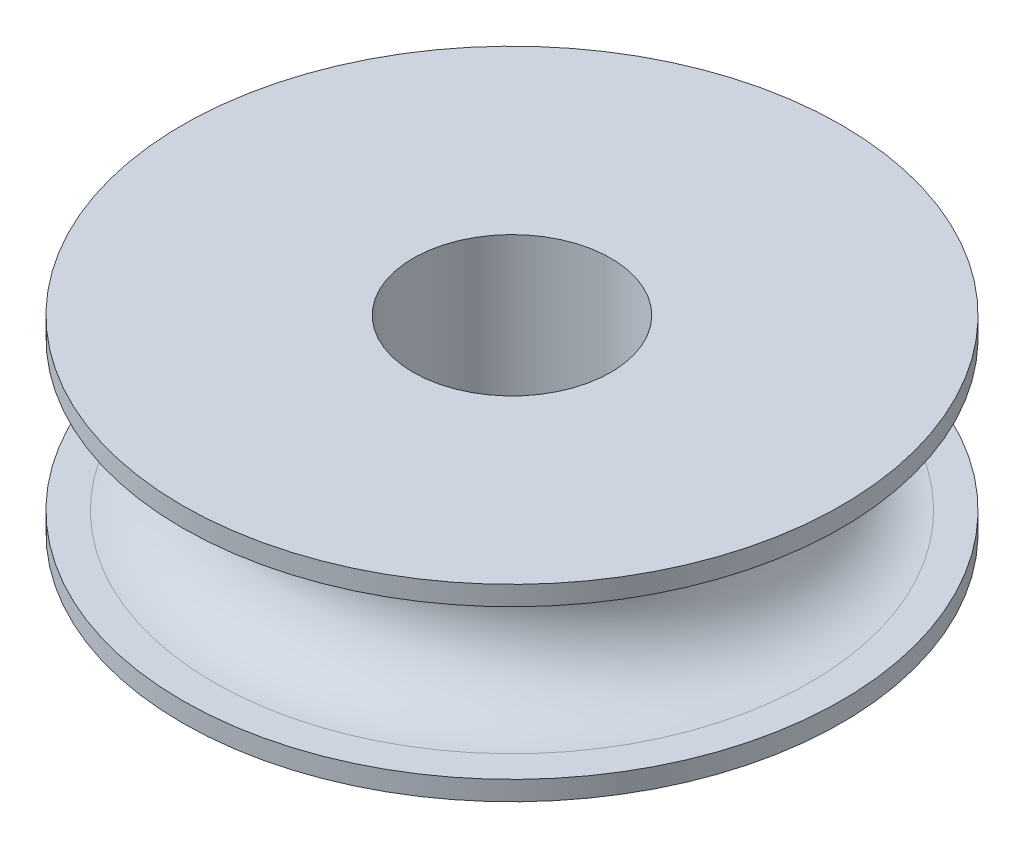
ISO-10303-21;
HEADER;
FILE_DESCRIPTION(('STEP AP214'),'2;1');
FILE_NAME('part.step','',(''),(''),'','','');
FILE_SCHEMA(('AUTOMOTIVE_DESIGN { 1 0 10303 214 1 1 1 1 }'));
ENDSEC;
DATA;
#1=APPLICATION_CONTEXT('core data for automotive mechanical design processes');
#2=APPLICATION_PROTOCOL_DEFINITION('international standard','automotive_design',2000,#1);
#3=PRODUCT_CONTEXT('',#1,'mechanical');
#4=PRODUCT('Part','Part','',(#3));
#5=PRODUCT_RELATED_PRODUCT_CATEGORY('part','',(#4));
#6=PRODUCT_DEFINITION_FORMATION('','',#4);
#7=PRODUCT_DEFINITION_CONTEXT('part definition',#1,'design');
#8=PRODUCT_DEFINITION('design','',#6,#7);
#9=PRODUCT_DEFINITION_SHAPE('','',#8);
#10=(LENGTH_UNIT() NAMED_UNIT(*) SI_UNIT(.MILLI.,.METRE.));
#11=(NAMED_UNIT(*) PLANE_ANGLE_UNIT() SI_UNIT($,.RADIAN.));
#12=(NAMED_UNIT(*) SI_UNIT($,.STERADIAN.) SOLID_ANGLE_UNIT());
#13=UNCERTAINTY_MEASURE_WITH_UNIT(LENGTH_MEASURE(1.E-05),#10,'distance_accuracy_value','');
#14=(GEOMETRIC_REPRESENTATION_CONTEXT(3) GLOBAL_UNCERTAINTY_ASSIGNED_CONTEXT((#13)) GLOBAL_UNIT_ASSIGNED_CONTEXT((#10,
#11,#12)) REPRESENTATION_CONTEXT('',''));
#15=CARTESIAN_POINT('',(0.,0.,0.));
#16=DIRECTION('',(0.,0.,1.));
#17=DIRECTION('',(1.,0.,0.));
#18=AXIS2_PLACEMENT_3D('',#15,#16,#17);
#19=CARTESIAN_POINT('',(-5.,-5.5,0.));
#20=DIRECTION('',(0.,-1.,0.));
#21=DIRECTION('',(0.,0.,-1.));
#22=AXIS2_PLACEMENT_3D('',#19,#20,#21);
#23=PLANE('',#22);
#24=CARTESIAN_POINT('',(0.,-5.5,0.));
#25=DIRECTION('',(0.,1.,0.));
#26=DIRECTION('',(0.,0.,1.));
#27=AXIS2_PLACEMENT_3D('',#24,#25,#26);
#28=CIRCLE('',#27,3.15);
#29=CARTESIAN_POINT('',(0.,-5.5,3.15));
#30=VERTEX_POINT('',#29);
#31=EDGE_CURVE('E64',#30,#30,#28,.T.);
#32=ORIENTED_EDGE('',*,*,#31,.T.);
#33=EDGE_LOOP('',(#32));
#34=FACE_BOUND('',#33,.T.);
#35=CARTESIAN_POINT('',(0.,-5.5,0.));
#36=DIRECTION('',(0.,1.,0.));
#37=DIRECTION('',(0.,0.,1.));
#38=AXIS2_PLACEMENT_3D('',#35,#36,#37);
#39=CIRCLE('',#38,5.);
#40=CARTESIAN_POINT('',(0.,-5.5,5.));
#41=VERTEX_POINT('',#40);
#42=EDGE_CURVE('E10',#41,#41,#39,.T.);
#43=ORIENTED_EDGE('',*,*,#42,.F.);
#44=EDGE_LOOP('',(#43));
#45=FACE_BOUND('',#44,.T.);
#46=ADVANCED_FACE('F33',(#34,#45),#23,.T.);
#47=CARTESIAN_POINT('',(0.,5.88818210542641,0.));
#48=DIRECTION('',(0.,1.,0.));
#49=DIRECTION('',(0.,0.,1.));
#50=AXIS2_PLACEMENT_3D('',#47,#48,#49);
#51=CYLINDRICAL_SURFACE('',#50,5.);
#52=CARTESIAN_POINT('',(4.93558507170123,-4.25,-0.799999999999994));
#53=CARTESIAN_POINT('',(4.93558585473547,-4.2053733138568,-0.799998185073409));
#54=CARTESIAN_POINT('',(4.93619688733532,-4.16072162366317,-0.796253222084032));
#55=CARTESIAN_POINT('',(4.93857300521684,-4.07266926107482,-0.781377782006159));
#56=CARTESIAN_POINT('',(4.94033918004371,-4.02926981020067,-0.770240332080269));
#57=CARTESIAN_POINT('',(4.94482054000624,-3.94500907475503,-0.740923891747521));
#58=CARTESIAN_POINT('',(4.94753495860065,-3.9041457713407,-0.72275058770329));
#59=CARTESIAN_POINT('',(4.95360605163724,-3.82605340784582,-0.679892166593979));
#60=CARTESIAN_POINT('',(4.95696264715696,-3.78882390202597,-0.655207849580235));
#61=CARTESIAN_POINT('',(4.96397400342678,-3.71871242688156,-0.599788560945842));
#62=CARTESIAN_POINT('',(4.96763096787548,-3.68586829379599,-0.569005994830315));
#63=CARTESIAN_POINT('',(4.97481140064582,-3.62578821613604,-0.502366839260941));
#64=CARTESIAN_POINT('',(4.97833486128557,-3.59855259387973,-0.466509958388676));
#65=CARTESIAN_POINT('',(4.98487450432198,-3.5503216154833,-0.390495966811719));
#66=CARTESIAN_POINT('',(4.98788779685136,-3.52936132386476,-0.350316337789534));
#67=CARTESIAN_POINT('',(4.99304311049062,-3.49450122437602,-0.266950398356383));
#68=CARTESIAN_POINT('',(4.99518518385959,-3.48060099300374,-0.223764268468985));
#69=CARTESIAN_POINT('',(4.99834115266823,-3.46037090225503,-0.136001651578426));
#70=CARTESIAN_POINT('',(4.99936450470397,-3.45397755223796,-0.091440145343762));
#71=CARTESIAN_POINT('',(5.00020018470641,-3.44874539676572,-0.00186592300890079));
#72=CARTESIAN_POINT('',(5.00001258881248,-3.44990611634203,0.0431467645452039));
#73=CARTESIAN_POINT('',(4.99845502458808,-3.45969939427402,0.131911886391412));
#74=CARTESIAN_POINT('',(4.99709586763407,-3.46826363369893,0.175672074928564));
#75=CARTESIAN_POINT('',(4.99335994390295,-3.49251340584986,0.261126137099067));
#76=CARTESIAN_POINT('',(4.99098314806818,-3.50819914192377,0.30281995169127));
#77=CARTESIAN_POINT('',(4.98546052013802,-3.54631538348005,0.383162394563612));
#78=CARTESIAN_POINT('',(4.98231146029854,-3.56877429095833,0.421797317397531));
#79=CARTESIAN_POINT('',(4.97559462459779,-3.6197785714468,0.494775868628127));
#80=CARTESIAN_POINT('',(4.97202681745693,-3.64832439926831,0.529119176053382));
#81=CARTESIAN_POINT('',(4.96482262808635,-3.7110718254241,0.592942886294138));
#82=CARTESIAN_POINT('',(4.96118592518751,-3.74533311033636,0.622364603286394));
#83=CARTESIAN_POINT('',(4.95429255402911,-3.81833710250877,0.675050723309759));
#84=CARTESIAN_POINT('',(4.95103588876406,-3.85707984507576,0.69831507782578));
#85=CARTESIAN_POINT('',(4.94527126199405,-3.93801220398281,0.738036126509164));
#86=CARTESIAN_POINT('',(4.94276403130194,-3.98020513406254,0.754486181687668));
#87=CARTESIAN_POINT('',(4.93879457567579,-4.06680424865733,0.780049416047773));
#88=CARTESIAN_POINT('',(4.93733226635919,-4.11121025414573,0.789163187678036));
#89=CARTESIAN_POINT('',(4.93563441966908,-4.20045112906939,0.799713399990509));
#90=CARTESIAN_POINT('',(4.9353855460576,-4.24527588587375,0.801233305499675));
#91=CARTESIAN_POINT('',(4.93610727492225,-4.33453958650626,0.796774670192975));
#92=CARTESIAN_POINT('',(4.93707783413686,-4.378978543965,0.790796395388178));
#93=CARTESIAN_POINT('',(4.94011677879918,-4.46594676217776,0.771582110819437));
#94=CARTESIAN_POINT('',(4.94217879200386,-4.50848556927231,0.758388213376957));
#95=CARTESIAN_POINT('',(4.94716299895284,-4.59074815480667,0.725161227645418));
#96=CARTESIAN_POINT('',(4.95008524049443,-4.63047177667274,0.705127759316014));
#97=CARTESIAN_POINT('',(4.95649180721203,-4.70634895723258,0.658591860869644));
#98=CARTESIAN_POINT('',(4.95998071331545,-4.74246918142802,0.632035720375417));
#99=CARTESIAN_POINT('',(4.96711393660611,-4.80977042425469,0.573282416990775));
#100=CARTESIAN_POINT('',(4.97075826382481,-4.84095112345601,0.541084889565662));
#101=CARTESIAN_POINT('',(4.97783368328296,-4.89779091683714,0.471593901952483));
#102=CARTESIAN_POINT('',(4.98126240933245,-4.92339449164431,0.434254752917194));
#103=CARTESIAN_POINT('',(4.98748283986874,-4.96796521839539,0.35575673895542));
#104=CARTESIAN_POINT('',(4.9902745636858,-4.98693257172911,0.314597989990528));
#105=CARTESIAN_POINT('',(4.99489611998972,-5.01760508960747,0.229797510837734));
#106=CARTESIAN_POINT('',(4.99672986677083,-5.02933984249439,0.186166705239429));
#107=CARTESIAN_POINT('',(4.99924535633416,-5.045309534557,0.0975221020879299));
#108=CARTESIAN_POINT('',(4.99992718616821,-5.0495450404616,0.0525084093030927));
#109=CARTESIAN_POINT('',(5.00006093539052,-5.0503807192317,-0.0370872642982857));
#110=CARTESIAN_POINT('',(4.9995264932218,-5.04706555976115,-0.081668457913194));
#111=CARTESIAN_POINT('',(4.99731544898762,-5.03307646469126,-0.169630532454884));
#112=CARTESIAN_POINT('',(4.99563885213226,-5.02240256265979,-0.213011418856085));
#113=CARTESIAN_POINT('',(4.9913311157785,-4.99403047006883,-0.297312849245192));
#114=CARTESIAN_POINT('',(4.98870088038932,-4.97633893118065,-0.338235680929926));
#115=CARTESIAN_POINT('',(4.98277371983535,-4.93444301584854,-0.416545279322136));
#116=CARTESIAN_POINT('',(4.9794767671163,-4.91023837021556,-0.453931899790391));
#117=CARTESIAN_POINT('',(4.9725381855774,-4.8557006718458,-0.524535556587544));
#118=CARTESIAN_POINT('',(4.96889327467274,-4.82530539880372,-0.557704213276182));
#119=CARTESIAN_POINT('',(4.96169293810507,-4.7593800524562,-0.618500476330203));
#120=CARTESIAN_POINT('',(4.95813753360885,-4.72384877771776,-0.646126782587249));
#121=CARTESIAN_POINT('',(4.95149402021015,-4.64838833042705,-0.695216766947152));
#122=CARTESIAN_POINT('',(4.94840907975937,-4.60843221987585,-0.716639464440317));
#123=CARTESIAN_POINT('',(4.94309308858453,-4.5254566841129,-0.752436729569794));
#124=CARTESIAN_POINT('',(4.94086117163203,-4.48244041937774,-0.766818451370858));
#125=CARTESIAN_POINT('',(4.93800748018891,-4.40770481675488,-0.784943942649531));
#126=CARTESIAN_POINT('',(4.93710403046998,-4.37644188261262,-0.790581080454425));
#127=CARTESIAN_POINT('',(4.93589255254275,-4.31345684217453,-0.798109724682122));
#128=CARTESIAN_POINT('',(4.93558451487318,-4.28173474318303,-0.800001290623027));
#129=CARTESIAN_POINT('',(4.93558507170123,-4.25,-0.799999999999994));
#130=B_SPLINE_CURVE_WITH_KNOTS('',3,(#52,#53,#54,#55,#56,#57,#58,#59,#60,#61,#62,#63,#64,#65,
#66,#67,#68,#69,#70,#71,#72,#73,#74,#75,#76,#77,#78,#79,#80,#81,#82,#83,#84,#85,#86,#87,#88,#89,
#90,#91,#92,#93,#94,#95,#96,#97,#98,#99,#100,#101,#102,#103,#104,#105,#106,#107,#108,#109,#110,
#111,#112,#113,#114,#115,#116,#117,#118,#119,#120,#121,#122,#123,#124,#125,#126,#127,#128,#129),
.UNSPECIFIED.,.T.,.F.,(4,2,2,2,2,2,2,2,2,2,2,2,2,2,2,2,2,2,2,2,2,2,2,2,2,2,2,2,2,2,2,2,2,2,2,2,
2,2,4),(0.,0.133764032978235,0.267654416240314,0.401436814708976,0.535202782098974,
0.670057077330419,0.804919120403261,0.940521238000374,1.07611522045935,1.21055394043863,
1.34498420755127,1.47818704938262,1.61139369493981,1.74516687269945,1.87895004942163,
2.01422953733833,2.14951009111739,2.28492213686846,2.42032324619165,2.5542328253214,
2.68813765390883,2.82126919083115,2.95440812640359,3.08868247170644,3.22296549674046,
3.35852970160141,3.49408979213058,3.62909156425648,3.7640831336681,3.89756846817798,
4.03105319378105,4.16441169698708,4.29777571279491,4.4325528842427,4.56736163445242,
4.70304160363667,4.83858342408623,4.93370665764443,5.02882837965776),.UNSPECIFIED.);
#131=CARTESIAN_POINT('',(4.93558507170123,-4.25,-0.799999999999994));
#132=VERTEX_POINT('',#131);
#133=EDGE_CURVE('E68',#132,#132,#130,.T.);
#134=ORIENTED_EDGE('',*,*,#133,.F.);
#135=EDGE_LOOP('',(#134));
#136=FACE_BOUND('',#135,.T.);
#137=ORIENTED_EDGE('',*,*,#42,.T.);
#138=EDGE_LOOP('',(#137));
#139=FACE_BOUND('',#138,.T.);
#140=CARTESIAN_POINT('',(0.,-3.,0.));
#141=DIRECTION('',(0.,1.,0.));
#142=DIRECTION('',(0.,0.,1.));
#143=AXIS2_PLACEMENT_3D('',#140,#141,#142);
#144=CIRCLE('',#143,5.);
#145=CARTESIAN_POINT('',(0.,-3.,5.));
#146=VERTEX_POINT('',#145);
#147=EDGE_CURVE('E39',#146,#146,#144,.T.);
#148=ORIENTED_EDGE('',*,*,#147,.F.);
#149=EDGE_LOOP('',(#148));
#150=FACE_BOUND('',#149,.T.);
#151=ADVANCED_FACE('F80',(#136,#139,#150),#51,.T.);
#152=CARTESIAN_POINT('',(-10.5,-3.,0.));
#153=DIRECTION('',(0.,-1.,0.));
#154=DIRECTION('',(0.,0.,-1.));
#155=AXIS2_PLACEMENT_3D('',#152,#153,#154);
#156=PLANE('',#155);
#157=ORIENTED_EDGE('',*,*,#147,.T.);
#158=EDGE_LOOP('',(#157));
#159=FACE_BOUND('',#158,.T.);
#160=CARTESIAN_POINT('',(0.,-3.,0.));
#161=DIRECTION('',(0.,1.,0.));
#162=DIRECTION('',(0.,0.,1.));
#163=AXIS2_PLACEMENT_3D('',#160,#161,#162);
#164=CIRCLE('',#163,10.5);
#165=CARTESIAN_POINT('',(0.,-3.,10.5));
#166=VERTEX_POINT('',#165);
#167=EDGE_CURVE('E43',#166,#166,#164,.T.);
#168=ORIENTED_EDGE('',*,*,#167,.F.);
#169=EDGE_LOOP('',(#168));
#170=FACE_BOUND('',#169,.T.);
#171=ADVANCED_FACE('F116',(#159,#170),#156,.T.);
#172=CARTESIAN_POINT('',(0.,5.88818210542641,0.));
#173=DIRECTION('',(0.,1.,0.));
#174=DIRECTION('',(0.,0.,1.));
#175=AXIS2_PLACEMENT_3D('',#172,#173,#174);
#176=CYLINDRICAL_SURFACE('',#175,10.5);
#177=ORIENTED_EDGE('',*,*,#167,.T.);
#178=EDGE_LOOP('',(#177));
#179=FACE_BOUND('',#178,.T.);
#180=CARTESIAN_POINT('',(0.,-2.38125,0.));
#181=DIRECTION('',(0.,1.,0.));
#182=DIRECTION('',(0.,0.,1.));
#183=AXIS2_PLACEMENT_3D('',#180,#181,#182);
#184=CIRCLE('',#183,10.5);
#185=CARTESIAN_POINT('',(0.,-2.38125,10.5));
#186=VERTEX_POINT('',#185);
#187=EDGE_CURVE('E47',#186,#186,#184,.T.);
#188=ORIENTED_EDGE('',*,*,#187,.F.);
#189=EDGE_LOOP('',(#188));
#190=FACE_BOUND('',#189,.T.);
#191=ADVANCED_FACE('F113',(#179,#190),#176,.T.);
#192=CARTESIAN_POINT('',(-10.5,-2.38125,0.));
#193=DIRECTION('',(0.,1.,0.));
#194=DIRECTION('',(0.,0.,1.));
#195=AXIS2_PLACEMENT_3D('',#192,#193,#194);
#196=PLANE('',#195);
#197=ORIENTED_EDGE('',*,*,#187,.T.);
#198=EDGE_LOOP('',(#197));
#199=FACE_BOUND('',#198,.T.);
#200=CARTESIAN_POINT('',(0.,-2.38125,0.));
#201=DIRECTION('',(0.,1.,0.));
#202=DIRECTION('',(0.,0.,1.));
#203=AXIS2_PLACEMENT_3D('',#200,#201,#202);
#204=CIRCLE('',#203,9.5);
#205=CARTESIAN_POINT('',(0.,-2.38125,9.5));
#206=VERTEX_POINT('',#205);
#207=EDGE_CURVE('E52',#206,#206,#204,.T.);
#208=ORIENTED_EDGE('',*,*,#207,.F.);
#209=EDGE_LOOP('',(#208));
#210=FACE_BOUND('',#209,.T.);
#211=ADVANCED_FACE('F109',(#199,#210),#196,.T.);
#212=CARTESIAN_POINT('',(0.,0.,0.));
#213=DIRECTION('',(0.,1.,0.));
#214=DIRECTION('',(0.,0.,1.));
#215=AXIS2_PLACEMENT_3D('',#212,#213,#214);
#216=TOROIDAL_SURFACE('',#215,9.5,2.38125);
#217=ORIENTED_EDGE('',*,*,#207,.T.);
#218=EDGE_LOOP('',(#217));
#219=FACE_BOUND('',#218,.T.);
#220=CARTESIAN_POINT('',(0.,2.38125,0.));
#221=DIRECTION('',(0.,1.,0.));
#222=DIRECTION('',(0.,0.,1.));
#223=AXIS2_PLACEMENT_3D('',#220,#221,#222);
#224=CIRCLE('',#223,9.5);
#225=CARTESIAN_POINT('',(0.,2.38125,9.5));
#226=VERTEX_POINT('',#225);
#227=EDGE_CURVE('E55',#226,#226,#224,.T.);
#228=ORIENTED_EDGE('',*,*,#227,.F.);
#229=EDGE_LOOP('',(#228));
#230=FACE_BOUND('',#229,.T.);
#231=ADVANCED_FACE('F105',(#219,#230),#216,.F.);
#232=CARTESIAN_POINT('',(-9.5,2.38125,0.));
#233=DIRECTION('',(0.,-1.,0.));
#234=DIRECTION('',(0.,0.,-1.));
#235=AXIS2_PLACEMENT_3D('',#232,#233,#234);
#236=PLANE('',#235);
#237=ORIENTED_EDGE('',*,*,#227,.T.);
#238=EDGE_LOOP('',(#237));
#239=FACE_BOUND('',#238,.T.);
#240=CARTESIAN_POINT('',(0.,2.38125,0.));
#241=DIRECTION('',(0.,1.,0.));
#242=DIRECTION('',(0.,0.,1.));
#243=AXIS2_PLACEMENT_3D('',#240,#241,#242);
#244=CIRCLE('',#243,10.5);
#245=CARTESIAN_POINT('',(0.,2.38125,10.5));
#246=VERTEX_POINT('',#245);
#247=EDGE_CURVE('E58',#246,#246,#244,.T.);
#248=ORIENTED_EDGE('',*,*,#247,.F.);
#249=EDGE_LOOP('',(#248));
#250=FACE_BOUND('',#249,.T.);
#251=ADVANCED_FACE('F101',(#239,#250),#236,.T.);
#252=CARTESIAN_POINT('',(0.,5.88818210542641,0.));
#253=DIRECTION('',(0.,1.,0.));
#254=DIRECTION('',(0.,0.,1.));
#255=AXIS2_PLACEMENT_3D('',#252,#253,#254);
#256=CYLINDRICAL_SURFACE('',#255,10.5);
#257=ORIENTED_EDGE('',*,*,#247,.T.);
#258=EDGE_LOOP('',(#257));
#259=FACE_BOUND('',#258,.T.);
#260=CARTESIAN_POINT('',(0.,3.,0.));
#261=DIRECTION('',(0.,1.,0.));
#262=DIRECTION('',(0.,0.,1.));
#263=AXIS2_PLACEMENT_3D('',#260,#261,#262);
#264=CIRCLE('',#263,10.5);
#265=CARTESIAN_POINT('',(0.,3.,10.5));
#266=VERTEX_POINT('',#265);
#267=EDGE_CURVE('E61',#266,#266,#264,.T.);
#268=ORIENTED_EDGE('',*,*,#267,.F.);
#269=EDGE_LOOP('',(#268));
#270=FACE_BOUND('',#269,.T.);
#271=ADVANCED_FACE('F97',(#259,#270),#256,.T.);
#272=CARTESIAN_POINT('',(-10.5,3.,0.));
#273=DIRECTION('',(0.,1.,0.));
#274=DIRECTION('',(0.,0.,1.));
#275=AXIS2_PLACEMENT_3D('',#272,#273,#274);
#276=PLANE('',#275);
#277=CARTESIAN_POINT('',(0.,3.,0.));
#278=DIRECTION('',(0.,1.,0.));
#279=DIRECTION('',(0.,0.,1.));
#280=AXIS2_PLACEMENT_3D('',#277,#278,#279);
#281=CIRCLE('',#280,3.15);
#282=CARTESIAN_POINT('',(0.,3.,3.15));
#283=VERTEX_POINT('',#282);
#284=EDGE_CURVE('E65',#283,#283,#281,.T.);
#285=ORIENTED_EDGE('',*,*,#284,.F.);
#286=EDGE_LOOP('',(#285));
#287=FACE_BOUND('',#286,.T.);
#288=ORIENTED_EDGE('',*,*,#267,.T.);
#289=EDGE_LOOP('',(#288));
#290=FACE_BOUND('',#289,.T.);
#291=ADVANCED_FACE('F93',(#287,#290),#276,.T.);
#292=CARTESIAN_POINT('',(0.,-5.5,0.));
#293=DIRECTION('',(0.,1.,0.));
#294=DIRECTION('',(0.,0.,1.));
#295=AXIS2_PLACEMENT_3D('',#292,#293,#294);
#296=CYLINDRICAL_SURFACE('',#295,3.15);
#297=CARTESIAN_POINT('',(3.04671954731643,-4.25,-0.799999999999994));
#298=CARTESIAN_POINT('',(3.04672037562088,-4.20584831992858,-0.799998787491232));
#299=CARTESIAN_POINT('',(3.04768977046248,-4.16168336372897,-0.796332478856327));
#300=CARTESIAN_POINT('',(3.05145231147786,-4.07462340259968,-0.781788518001451));
#301=CARTESIAN_POINT('',(3.05424648470091,-4.03172912707473,-0.770906804645788));
#302=CARTESIAN_POINT('',(3.06132217525296,-3.94848242249005,-0.742308305649663));
#303=CARTESIAN_POINT('',(3.06560173214644,-3.90812672548843,-0.724600525781015));
#304=CARTESIAN_POINT('',(3.07516353708976,-3.83095403317907,-0.682880169734236));
#305=CARTESIAN_POINT('',(3.08044583603438,-3.79413721763238,-0.658867273512338));
#306=CARTESIAN_POINT('',(3.09155223041649,-3.72425150673387,-0.604635833440505));
#307=CARTESIAN_POINT('',(3.09738520663052,-3.69127481638871,-0.574300264191975));
#308=CARTESIAN_POINT('',(3.10885877769155,-3.63081839913785,-0.508536568917144));
#309=CARTESIAN_POINT('',(3.11449935406675,-3.60333919880649,-0.473107955614191));
#310=CARTESIAN_POINT('',(3.12505103772182,-3.55427886613002,-0.397530396505204));
#311=CARTESIAN_POINT('',(3.12995044392561,-3.53278856722371,-0.357320712058883));
#312=CARTESIAN_POINT('',(3.13836630541931,-3.49690708703895,-0.273714256198096));
#313=CARTESIAN_POINT('',(3.1418829714787,-3.48251482373003,-0.230317971711088));
#314=CARTESIAN_POINT('',(3.14707433539005,-3.46153401122193,-0.142531701820605));
#315=CARTESIAN_POINT('',(3.14878595459454,-3.45478881963622,-0.0981813750153107));
#316=CARTESIAN_POINT('',(3.15030313322582,-3.44880166645475,-0.0089478184607158));
#317=CARTESIAN_POINT('',(3.150108983113,-3.44955856145795,0.0359353290393381));
#318=CARTESIAN_POINT('',(3.14786388222345,-3.45844198255923,0.123873150955544));
#319=CARTESIAN_POINT('',(3.14585554271486,-3.46639939195366,0.166946161605962));
#320=CARTESIAN_POINT('',(3.1402574919405,-3.48918580490495,0.251124305993878));
#321=CARTESIAN_POINT('',(3.13666769501371,-3.50401518069018,0.292229333000075));
#322=CARTESIAN_POINT('',(3.12824535898402,-3.54025971594598,0.371747015245165));
#323=CARTESIAN_POINT('',(3.12340162952679,-3.56173453656553,0.410131242711211));
#324=CARTESIAN_POINT('',(3.11299603080796,-3.61061499096602,0.482810089750206));
#325=CARTESIAN_POINT('',(3.107434033124,-3.63802168592684,0.517103975878619));
#326=CARTESIAN_POINT('',(3.09601405024654,-3.69889246441776,0.581637476849313));
#327=CARTESIAN_POINT('',(3.09015213668696,-3.73250426901405,0.611737212204872));
#328=CARTESIAN_POINT('',(3.07893459013064,-3.80435968543896,0.665904739897344));
#329=CARTESIAN_POINT('',(3.07357898238748,-3.84260352808812,0.689972231456058));
#330=CARTESIAN_POINT('',(3.06396595614438,-3.92291850349832,0.731485527959731));
#331=CARTESIAN_POINT('',(3.05971432517762,-3.96500830215592,0.74889665355609));
#332=CARTESIAN_POINT('',(3.05286429526141,-4.05165187295297,0.776351724296638));
#333=CARTESIAN_POINT('',(3.05026552965418,-4.09620509624175,0.786397303427492));
#334=CARTESIAN_POINT('',(3.04709270125328,-4.18521103325889,0.79860194445219));
#335=CARTESIAN_POINT('',(3.04646544638303,-4.22963346573185,0.800968254421254));
#336=CARTESIAN_POINT('',(3.04716169633487,-4.31823870789063,0.798315414932798));
#337=CARTESIAN_POINT('',(3.04848501516182,-4.36242154002013,0.793296969641833));
#338=CARTESIAN_POINT('',(3.05288224097786,-4.44851712971965,0.776199028048116));
#339=CARTESIAN_POINT('',(3.05592598509977,-4.49045571844924,0.76424110222188));
#340=CARTESIAN_POINT('',(3.06339227746886,-4.57173285910573,0.733738872080799));
#341=CARTESIAN_POINT('',(3.06781499303056,-4.61107109482205,0.715193768486928));
#342=CARTESIAN_POINT('',(3.07765223610146,-4.68690641571195,0.671612872592893));
#343=CARTESIAN_POINT('',(3.08308497232224,-4.72333017378177,0.646453685524547));
#344=CARTESIAN_POINT('',(3.0942858829292,-4.7915149787894,0.59051410569404));
#345=CARTESIAN_POINT('',(3.10005411416964,-4.82327523219913,0.559732758276661));
#346=CARTESIAN_POINT('',(3.1114570173882,-4.88207582550781,0.492469744445853));
#347=CARTESIAN_POINT('',(3.11708435475773,-4.90897252569249,0.455861030897154));
#348=CARTESIAN_POINT('',(3.12741700181015,-4.95623705219499,0.378526653870692));
#349=CARTESIAN_POINT('',(3.13212235994353,-4.97660522162626,0.337801206899976));
#350=CARTESIAN_POINT('',(3.14005099930513,-5.01005500980664,0.253672778818784));
#351=CARTESIAN_POINT('',(3.14328502472949,-5.02318960425132,0.210291921723113));
#352=CARTESIAN_POINT('',(3.14795371059435,-5.04195729751027,0.121845363558599));
#353=CARTESIAN_POINT('',(3.14938873017106,-5.04759189356591,0.0767800006187538));
#354=CARTESIAN_POINT('',(3.15028252080941,-5.05111317588415,-0.012408680114312));
#355=CARTESIAN_POINT('',(3.1497952849568,-5.04921153611712,-0.0565232241986988));
#356=CARTESIAN_POINT('',(3.14701959516578,-5.03820070853938,-0.143782456005576));
#357=CARTESIAN_POINT('',(3.14473119796158,-5.02909174774974,-0.186927174232278));
#358=CARTESIAN_POINT('',(3.1386192227224,-5.00403986046255,-0.270792749677217));
#359=CARTESIAN_POINT('',(3.13480449671293,-4.98813630414253,-0.311526054708035));
#360=CARTESIAN_POINT('',(3.12604088416691,-4.94998221759256,-0.38976925941551));
#361=CARTESIAN_POINT('',(3.12109185072981,-4.92773086518824,-0.42727874071908));
#362=CARTESIAN_POINT('',(3.11044020828261,-4.87687332604076,-0.499009036121088));
#363=CARTESIAN_POINT('',(3.10472205617257,-4.84812427499131,-0.533126248782787));
#364=CARTESIAN_POINT('',(3.09324487456525,-4.78536329597628,-0.596123912464206));
#365=CARTESIAN_POINT('',(3.08748583499281,-4.75135002463132,-0.625003022672402));
#366=CARTESIAN_POINT('',(3.07645128983346,-4.67823121847672,-0.677256343279082));
#367=CARTESIAN_POINT('',(3.07118734386755,-4.63903963316484,-0.700512781076032));
#368=CARTESIAN_POINT('',(3.06189623834876,-4.55717457495404,-0.740072440308267));
#369=CARTESIAN_POINT('',(3.05786820031328,-4.5145036026363,-0.756380603791757));
#370=CARTESIAN_POINT('',(3.05211833149557,-4.43493838785163,-0.779220505535315));
#371=CARTESIAN_POINT('',(3.05010928406368,-4.39841690805514,-0.786995531950328));
#372=CARTESIAN_POINT('',(3.04740960233127,-4.32460006403489,-0.797385555480301));
#373=CARTESIAN_POINT('',(3.04671884746293,-4.28730477089763,-0.800001024476559));
#374=CARTESIAN_POINT('',(3.04671954731643,-4.25,-0.799999999999994));
#375=B_SPLINE_CURVE_WITH_KNOTS('',3,(#297,#298,#299,#300,#301,#302,#303,#304,#305,#306,#307,
#308,#309,#310,#311,#312,#313,#314,#315,#316,#317,#318,#319,#320,#321,#322,#323,#324,#325,#326,
#327,#328,#329,#330,#331,#332,#333,#334,#335,#336,#337,#338,#339,#340,#341,#342,#343,#344,#345,
#346,#347,#348,#349,#350,#351,#352,#353,#354,#355,#356,#357,#358,#359,#360,#361,#362,#363,#364,
#365,#366,#367,#368,#369,#370,#371,#372,#373,#374),.UNSPECIFIED.,.T.,.F.,(4,2,2,2,2,2,2,2,2,2,2,
2,2,2,2,2,2,2,2,2,2,2,2,2,2,2,2,2,2,2,2,2,2,2,2,2,2,2,4),(0.,0.132318004328743,
0.264710546128431,0.396929014210454,0.529154194917143,0.664087485925241,0.799033695269598,
0.935927228108652,1.07279988632832,1.20681510912295,1.34080990682816,1.47173703389584,
1.60267125361889,1.73481685320754,1.86698611248956,2.00284445787236,2.13870957604224,
2.27527319966463,2.41180651858235,2.54462302607884,2.67742686979991,2.80797153721006,
2.93853205014344,3.07172647474599,3.20494353711699,3.34161278102701,3.47827484097058,
3.61392226404176,3.74954260345277,3.88138108182068,4.01321540761624,4.14429598569531,
4.27539354920658,4.40971613795174,4.5440730612461,4.68103871106558,4.81790677903832,
4.9297155332035,5.04151406112203),.UNSPECIFIED.);
#376=CARTESIAN_POINT('',(3.04671954731643,-4.25,-0.799999999999994));
#377=VERTEX_POINT('',#376);
#378=EDGE_CURVE('E76',#377,#377,#375,.T.);
#379=ORIENTED_EDGE('',*,*,#378,.T.);
#380=EDGE_LOOP('',(#379));
#381=FACE_BOUND('',#380,.T.);
#382=ORIENTED_EDGE('',*,*,#31,.F.);
#383=EDGE_LOOP('',(#382));
#384=FACE_BOUND('',#383,.T.);
#385=ORIENTED_EDGE('',*,*,#284,.T.);
#386=EDGE_LOOP('',(#385));
#387=FACE_BOUND('',#386,.T.);
#388=ADVANCED_FACE('F86',(#381,#384,#387),#296,.F.);
#389=CARTESIAN_POINT('',(5.,-4.25,0.));
#390=DIRECTION('',(1.,0.,0.));
#391=DIRECTION('',(0.,0.,-1.));
#392=AXIS2_PLACEMENT_3D('',#389,#390,#391);
#393=CYLINDRICAL_SURFACE('',#392,0.799999999999994);
#394=ORIENTED_EDGE('',*,*,#133,.T.);
#395=EDGE_LOOP('',(#394));
#396=FACE_BOUND('',#395,.T.);
#397=ORIENTED_EDGE('',*,*,#378,.F.);
#398=EDGE_LOOP('',(#397));
#399=FACE_BOUND('',#398,.T.);
#400=ADVANCED_FACE('F83',(#396,#399),#393,.F.);
#401=CLOSED_SHELL('',(#46,#151,#171,#191,#211,#231,#251,#271,#291,#388,#400));
#402=MANIFOLD_SOLID_BREP('B2',#401);
#403=ADVANCED_BREP_SHAPE_REPRESENTATION('',(#18,#402),#14);
#404=SHAPE_DEFINITION_REPRESENTATION(#9,#403);
ENDSEC;
END-ISO-10303-21;
